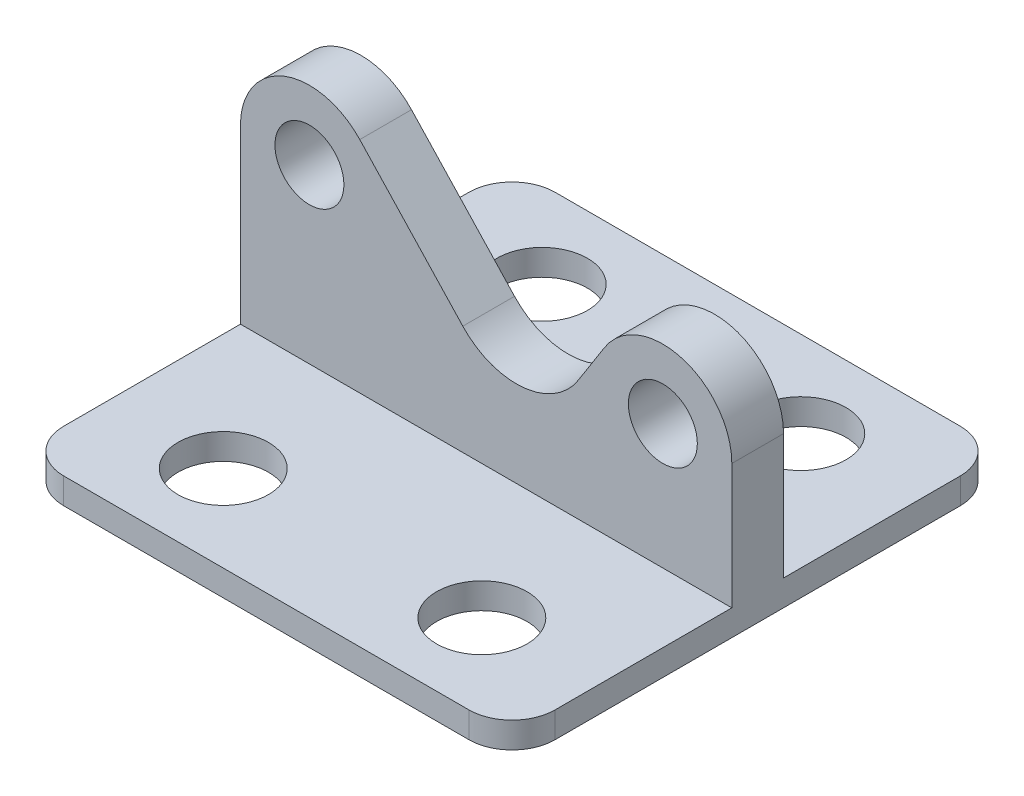
ISO-10303-21;
HEADER;
FILE_DESCRIPTION(('STEP AP214'),'2;1');
FILE_NAME('part.step','',(''),(''),'','','');
FILE_SCHEMA(('AUTOMOTIVE_DESIGN { 1 0 10303 214 1 1 1 1 }'));
ENDSEC;
DATA;
#1=APPLICATION_CONTEXT('core data for automotive mechanical design processes');
#2=APPLICATION_PROTOCOL_DEFINITION('international standard','automotive_design',2000,#1);
#3=PRODUCT_CONTEXT('',#1,'mechanical');
#4=PRODUCT('Part','Part','',(#3));
#5=PRODUCT_RELATED_PRODUCT_CATEGORY('part','',(#4));
#6=PRODUCT_DEFINITION_FORMATION('','',#4);
#7=PRODUCT_DEFINITION_CONTEXT('part definition',#1,'design');
#8=PRODUCT_DEFINITION('design','',#6,#7);
#9=PRODUCT_DEFINITION_SHAPE('','',#8);
#10=(LENGTH_UNIT() NAMED_UNIT(*) SI_UNIT(.MILLI.,.METRE.));
#11=(NAMED_UNIT(*) PLANE_ANGLE_UNIT() SI_UNIT($,.RADIAN.));
#12=(NAMED_UNIT(*) SI_UNIT($,.STERADIAN.) SOLID_ANGLE_UNIT());
#13=UNCERTAINTY_MEASURE_WITH_UNIT(LENGTH_MEASURE(1.E-05),#10,'distance_accuracy_value','');
#14=(GEOMETRIC_REPRESENTATION_CONTEXT(3) GLOBAL_UNCERTAINTY_ASSIGNED_CONTEXT((#13)) GLOBAL_UNIT_ASSIGNED_CONTEXT((#10,
#11,#12)) REPRESENTATION_CONTEXT('',''));
#15=CARTESIAN_POINT('',(0.,0.,0.));
#16=DIRECTION('',(0.,0.,1.));
#17=DIRECTION('',(1.,0.,0.));
#18=AXIS2_PLACEMENT_3D('',#15,#16,#17);
#19=CARTESIAN_POINT('',(49.,17.5,3.));
#20=DIRECTION('',(0.,0.,1.));
#21=DIRECTION('',(1.,0.,0.));
#22=AXIS2_PLACEMENT_3D('',#19,#20,#21);
#23=PLANE('',#22);
#24=DIRECTION('',(-1.,0.,0.));
#25=VECTOR('',#24,1.);
#26=CARTESIAN_POINT('',(49.,3.,3.));
#27=LINE('',#26,#25);
#28=CARTESIAN_POINT('',(57.,3.,3.));
#29=VERTEX_POINT('',#28);
#30=CARTESIAN_POINT('',(0.,3.,3.));
#31=VERTEX_POINT('',#30);
#32=EDGE_CURVE('E54',#29,#31,#27,.T.);
#33=ORIENTED_EDGE('',*,*,#32,.F.);
#34=DIRECTION('',(0.,1.,0.));
#35=VECTOR('',#34,1.);
#36=CARTESIAN_POINT('',(57.,0.,3.));
#37=LINE('',#36,#35);
#38=CARTESIAN_POINT('',(57.,17.5,3.));
#39=VERTEX_POINT('',#38);
#40=EDGE_CURVE('E211',#29,#39,#37,.T.);
#41=ORIENTED_EDGE('',*,*,#40,.T.);
#42=CARTESIAN_POINT('',(49.,17.5,3.));
#43=DIRECTION('',(0.,0.,1.));
#44=DIRECTION('',(1.,0.,0.));
#45=AXIS2_PLACEMENT_3D('',#42,#43,#44);
#46=CIRCLE('',#45,8.);
#47=CARTESIAN_POINT('',(42.243043836971,21.7829363071267,3.));
#48=VERTEX_POINT('',#47);
#49=EDGE_CURVE('E213',#39,#48,#46,.T.);
#50=ORIENTED_EDGE('',*,*,#49,.T.);
#51=DIRECTION('',(-0.535367038390841,-0.844619520378626,0.));
#52=VECTOR('',#51,1.);
#53=CARTESIAN_POINT('',(42.243043836971,21.7829363071267,3.));
#54=LINE('',#53,#52);
#55=CARTESIAN_POINT('',(39.1792659232183,16.9493801736778,3.));
#56=VERTEX_POINT('',#55);
#57=EDGE_CURVE('E215',#48,#56,#54,.T.);
#58=ORIENTED_EDGE('',*,*,#57,.T.);
#59=CARTESIAN_POINT('',(32.,21.5,3.));
#60=DIRECTION('',(0.,0.,-1.));
#61=DIRECTION('',(-1.,0.,0.));
#62=AXIS2_PLACEMENT_3D('',#59,#60,#61);
#63=CIRCLE('',#62,8.50000000000001);
#64=CARTESIAN_POINT('',(25.7932833376951,15.6925334031209,3.));
#65=VERTEX_POINT('',#64);
#66=EDGE_CURVE('E217',#56,#65,#63,.T.);
#67=ORIENTED_EDGE('',*,*,#66,.T.);
#68=DIRECTION('',(-0.683231364338715,0.73020196027117,0.));
#69=VECTOR('',#68,1.);
#70=CARTESIAN_POINT('',(25.7932833376951,15.6925334031209,3.));
#71=LINE('',#70,#69);
#72=CARTESIAN_POINT('',(13.8416156821694,28.4658509147097,3.));
#73=VERTEX_POINT('',#72);
#74=EDGE_CURVE('E219',#65,#73,#71,.T.);
#75=ORIENTED_EDGE('',*,*,#74,.T.);
#76=CARTESIAN_POINT('',(8.,23.,3.));
#77=DIRECTION('',(0.,0.,1.));
#78=DIRECTION('',(1.,0.,0.));
#79=AXIS2_PLACEMENT_3D('',#76,#77,#78);
#80=CIRCLE('',#79,8.);
#81=CARTESIAN_POINT('',(0.,23.,3.));
#82=VERTEX_POINT('',#81);
#83=EDGE_CURVE('E221',#73,#82,#80,.T.);
#84=ORIENTED_EDGE('',*,*,#83,.T.);
#85=DIRECTION('',(0.,-1.,0.));
#86=VECTOR('',#85,1.);
#87=CARTESIAN_POINT('',(0.,23.,3.));
#88=LINE('',#87,#86);
#89=EDGE_CURVE('E50',#82,#31,#88,.T.);
#90=ORIENTED_EDGE('',*,*,#89,.T.);
#91=EDGE_LOOP('',(#33,#41,#50,#58,#67,#75,#84,#90));
#92=FACE_BOUND('',#91,.T.);
#93=CARTESIAN_POINT('',(49.,17.5,3.));
#94=DIRECTION('',(0.,0.,1.));
#95=DIRECTION('',(1.,0.,0.));
#96=AXIS2_PLACEMENT_3D('',#93,#94,#95);
#97=CIRCLE('',#96,4.);
#98=CARTESIAN_POINT('',(53.,17.5,3.));
#99=VERTEX_POINT('',#98);
#100=EDGE_CURVE('E207',#99,#99,#97,.T.);
#101=ORIENTED_EDGE('',*,*,#100,.F.);
#102=EDGE_LOOP('',(#101));
#103=FACE_BOUND('',#102,.T.);
#104=CARTESIAN_POINT('',(8.,23.,3.));
#105=DIRECTION('',(0.,0.,1.));
#106=DIRECTION('',(1.,0.,0.));
#107=AXIS2_PLACEMENT_3D('',#104,#105,#106);
#108=CIRCLE('',#107,4.);
#109=CARTESIAN_POINT('',(12.,23.,3.));
#110=VERTEX_POINT('',#109);
#111=EDGE_CURVE('E204',#110,#110,#108,.T.);
#112=ORIENTED_EDGE('',*,*,#111,.F.);
#113=EDGE_LOOP('',(#112));
#114=FACE_BOUND('',#113,.T.);
#115=ADVANCED_FACE('F35',(#92,#103,#114),#23,.T.);
#116=CARTESIAN_POINT('',(0.,23.,3.));
#117=DIRECTION('',(1.,0.,0.));
#118=DIRECTION('',(0.,0.,-1.));
#119=AXIS2_PLACEMENT_3D('',#116,#117,#118);
#120=PLANE('',#119);
#121=DIRECTION('',(0.,-1.,0.));
#122=VECTOR('',#121,1.);
#123=CARTESIAN_POINT('',(0.,23.,-3.));
#124=LINE('',#123,#122);
#125=CARTESIAN_POINT('',(0.,23.,-3.));
#126=VERTEX_POINT('',#125);
#127=CARTESIAN_POINT('',(0.,3.,-3.));
#128=VERTEX_POINT('',#127);
#129=EDGE_CURVE('E184',#126,#128,#124,.T.);
#130=ORIENTED_EDGE('',*,*,#129,.T.);
#131=DIRECTION('',(0.,0.,1.));
#132=VECTOR('',#131,1.);
#133=CARTESIAN_POINT('',(0.,3.,-23.5));
#134=LINE('',#133,#132);
#135=CARTESIAN_POINT('',(0.,3.,-23.5));
#136=VERTEX_POINT('',#135);
#137=EDGE_CURVE('E256',#136,#128,#134,.T.);
#138=ORIENTED_EDGE('',*,*,#137,.F.);
#139=DIRECTION('',(0.,-1.,0.));
#140=VECTOR('',#139,1.);
#141=CARTESIAN_POINT('',(0.,3.,-23.5));
#142=LINE('',#141,#140);
#143=CARTESIAN_POINT('',(0.,0.,-23.5));
#144=VERTEX_POINT('',#143);
#145=EDGE_CURVE('E250',#136,#144,#142,.T.);
#146=ORIENTED_EDGE('',*,*,#145,.T.);
#147=DIRECTION('',(0.,0.,-1.));
#148=VECTOR('',#147,1.);
#149=CARTESIAN_POINT('',(0.,0.,3.));
#150=LINE('',#149,#148);
#151=CARTESIAN_POINT('',(0.,0.,23.5));
#152=VERTEX_POINT('',#151);
#153=EDGE_CURVE('E43',#152,#144,#150,.T.);
#154=ORIENTED_EDGE('',*,*,#153,.F.);
#155=DIRECTION('',(0.,-1.,0.));
#156=VECTOR('',#155,1.);
#157=CARTESIAN_POINT('',(0.,3.,23.5));
#158=LINE('',#157,#156);
#159=CARTESIAN_POINT('',(0.,3.,23.5));
#160=VERTEX_POINT('',#159);
#161=EDGE_CURVE('E257',#160,#152,#158,.T.);
#162=ORIENTED_EDGE('',*,*,#161,.F.);
#163=EDGE_CURVE('E163',#31,#160,#134,.T.);
#164=ORIENTED_EDGE('',*,*,#163,.F.);
#165=ORIENTED_EDGE('',*,*,#89,.F.);
#166=DIRECTION('',(0.,0.,-1.));
#167=VECTOR('',#166,1.);
#168=CARTESIAN_POINT('',(0.,23.,3.));
#169=LINE('',#168,#167);
#170=EDGE_CURVE('E223',#82,#126,#169,.T.);
#171=ORIENTED_EDGE('',*,*,#170,.T.);
#172=EDGE_LOOP('',(#130,#138,#146,#154,#162,#164,#165,#171));
#173=FACE_BOUND('',#172,.T.);
#174=ADVANCED_FACE('F37',(#173),#120,.F.);
#175=CARTESIAN_POINT('',(0.,0.,3.));
#176=DIRECTION('',(0.,1.,0.));
#177=DIRECTION('',(0.,0.,1.));
#178=AXIS2_PLACEMENT_3D('',#175,#176,#177);
#179=PLANE('',#178);
#180=ORIENTED_EDGE('',*,*,#153,.T.);
#181=CARTESIAN_POINT('',(5.,0.,-23.5));
#182=DIRECTION('',(0.,1.,0.));
#183=DIRECTION('',(0.,0.,1.));
#184=AXIS2_PLACEMENT_3D('',#181,#182,#183);
#185=CIRCLE('',#184,5.);
#186=CARTESIAN_POINT('',(5.,0.,-28.5));
#187=VERTEX_POINT('',#186);
#188=EDGE_CURVE('E167',#187,#144,#185,.T.);
#189=ORIENTED_EDGE('',*,*,#188,.F.);
#190=DIRECTION('',(-1.,0.,0.));
#191=VECTOR('',#190,1.);
#192=CARTESIAN_POINT('',(52.,0.,-28.5));
#193=LINE('',#192,#191);
#194=CARTESIAN_POINT('',(52.,0.,-28.5));
#195=VERTEX_POINT('',#194);
#196=EDGE_CURVE('E254',#195,#187,#193,.T.);
#197=ORIENTED_EDGE('',*,*,#196,.F.);
#198=CARTESIAN_POINT('',(52.,0.,-23.5));
#199=DIRECTION('',(0.,1.,0.));
#200=DIRECTION('',(0.,0.,1.));
#201=AXIS2_PLACEMENT_3D('',#198,#199,#200);
#202=CIRCLE('',#201,5.00000000000001);
#203=CARTESIAN_POINT('',(57.,0.,-23.5));
#204=VERTEX_POINT('',#203);
#205=EDGE_CURVE('E279',#204,#195,#202,.T.);
#206=ORIENTED_EDGE('',*,*,#205,.F.);
#207=DIRECTION('',(0.,0.,-1.));
#208=VECTOR('',#207,1.);
#209=CARTESIAN_POINT('',(57.,0.,3.));
#210=LINE('',#209,#208);
#211=CARTESIAN_POINT('',(57.,0.,23.5));
#212=VERTEX_POINT('',#211);
#213=EDGE_CURVE('E236',#212,#204,#210,.T.);
#214=ORIENTED_EDGE('',*,*,#213,.F.);
#215=CARTESIAN_POINT('',(52.,0.,23.5));
#216=DIRECTION('',(0.,1.,0.));
#217=DIRECTION('',(0.,0.,1.));
#218=AXIS2_PLACEMENT_3D('',#215,#216,#217);
#219=CIRCLE('',#218,5.00000000000001);
#220=CARTESIAN_POINT('',(52.,0.,28.5));
#221=VERTEX_POINT('',#220);
#222=EDGE_CURVE('E278',#221,#212,#219,.T.);
#223=ORIENTED_EDGE('',*,*,#222,.F.);
#224=DIRECTION('',(1.,0.,0.));
#225=VECTOR('',#224,1.);
#226=CARTESIAN_POINT('',(5.,0.,28.5));
#227=LINE('',#226,#225);
#228=CARTESIAN_POINT('',(5.,0.,28.5));
#229=VERTEX_POINT('',#228);
#230=EDGE_CURVE('E280',#229,#221,#227,.T.);
#231=ORIENTED_EDGE('',*,*,#230,.F.);
#232=CARTESIAN_POINT('',(5.,0.,23.5));
#233=DIRECTION('',(0.,1.,0.));
#234=DIRECTION('',(0.,0.,1.));
#235=AXIS2_PLACEMENT_3D('',#232,#233,#234);
#236=CIRCLE('',#235,5.);
#237=EDGE_CURVE('E171',#152,#229,#236,.T.);
#238=ORIENTED_EDGE('',*,*,#237,.F.);
#239=EDGE_LOOP('',(#180,#189,#197,#206,#214,#223,#231,#238));
#240=FACE_BOUND('',#239,.T.);
#241=CARTESIAN_POINT('',(13.5,0.,-18.5));
#242=DIRECTION('',(0.,1.,0.));
#243=DIRECTION('',(0.,0.,1.));
#244=AXIS2_PLACEMENT_3D('',#241,#242,#243);
#245=CIRCLE('',#244,5.25);
#246=CARTESIAN_POINT('',(13.5,0.,-13.25));
#247=VERTEX_POINT('',#246);
#248=EDGE_CURVE('E341',#247,#247,#245,.T.);
#249=ORIENTED_EDGE('',*,*,#248,.T.);
#250=EDGE_LOOP('',(#249));
#251=FACE_BOUND('',#250,.T.);
#252=CARTESIAN_POINT('',(43.5,0.,-18.5));
#253=DIRECTION('',(0.,1.,0.));
#254=DIRECTION('',(0.,0.,1.));
#255=AXIS2_PLACEMENT_3D('',#252,#253,#254);
#256=CIRCLE('',#255,5.25);
#257=CARTESIAN_POINT('',(43.5,0.,-13.25));
#258=VERTEX_POINT('',#257);
#259=EDGE_CURVE('E329',#258,#258,#256,.T.);
#260=ORIENTED_EDGE('',*,*,#259,.T.);
#261=EDGE_LOOP('',(#260));
#262=FACE_BOUND('',#261,.T.);
#263=CARTESIAN_POINT('',(43.5,0.,18.5));
#264=DIRECTION('',(0.,1.,0.));
#265=DIRECTION('',(0.,0.,1.));
#266=AXIS2_PLACEMENT_3D('',#263,#264,#265);
#267=CIRCLE('',#266,5.25);
#268=CARTESIAN_POINT('',(43.5,0.,23.75));
#269=VERTEX_POINT('',#268);
#270=EDGE_CURVE('E321',#269,#269,#267,.T.);
#271=ORIENTED_EDGE('',*,*,#270,.T.);
#272=EDGE_LOOP('',(#271));
#273=FACE_BOUND('',#272,.T.);
#274=CARTESIAN_POINT('',(13.5,0.,18.5));
#275=DIRECTION('',(0.,1.,0.));
#276=DIRECTION('',(0.,0.,1.));
#277=AXIS2_PLACEMENT_3D('',#274,#275,#276);
#278=CIRCLE('',#277,5.25);
#279=CARTESIAN_POINT('',(13.5,0.,23.75));
#280=VERTEX_POINT('',#279);
#281=EDGE_CURVE('E335',#280,#280,#278,.T.);
#282=ORIENTED_EDGE('',*,*,#281,.T.);
#283=EDGE_LOOP('',(#282));
#284=FACE_BOUND('',#283,.T.);
#285=ADVANCED_FACE('F240',(#240,#251,#262,#273,#284),#179,.F.);
#286=CARTESIAN_POINT('',(57.,0.,3.));
#287=DIRECTION('',(-1.,0.,0.));
#288=DIRECTION('',(0.,0.,1.));
#289=AXIS2_PLACEMENT_3D('',#286,#287,#288);
#290=PLANE('',#289);
#291=ORIENTED_EDGE('',*,*,#40,.F.);
#292=DIRECTION('',(0.,0.,-1.));
#293=VECTOR('',#292,1.);
#294=CARTESIAN_POINT('',(57.,3.,23.5));
#295=LINE('',#294,#293);
#296=CARTESIAN_POINT('',(57.,3.,23.5));
#297=VERTEX_POINT('',#296);
#298=EDGE_CURVE('E273',#297,#29,#295,.T.);
#299=ORIENTED_EDGE('',*,*,#298,.F.);
#300=DIRECTION('',(0.,-1.,0.));
#301=VECTOR('',#300,1.);
#302=CARTESIAN_POINT('',(57.,3.,23.5));
#303=LINE('',#302,#301);
#304=EDGE_CURVE('E175',#297,#212,#303,.T.);
#305=ORIENTED_EDGE('',*,*,#304,.T.);
#306=ORIENTED_EDGE('',*,*,#213,.T.);
#307=DIRECTION('',(0.,-1.,0.));
#308=VECTOR('',#307,1.);
#309=CARTESIAN_POINT('',(57.,3.,-23.5));
#310=LINE('',#309,#308);
#311=CARTESIAN_POINT('',(57.,3.,-23.5));
#312=VERTEX_POINT('',#311);
#313=EDGE_CURVE('E265',#312,#204,#310,.T.);
#314=ORIENTED_EDGE('',*,*,#313,.F.);
#315=CARTESIAN_POINT('',(57.,3.,-3.));
#316=VERTEX_POINT('',#315);
#317=EDGE_CURVE('E296',#316,#312,#295,.T.);
#318=ORIENTED_EDGE('',*,*,#317,.F.);
#319=DIRECTION('',(0.,1.,0.));
#320=VECTOR('',#319,1.);
#321=CARTESIAN_POINT('',(57.,0.,-3.));
#322=LINE('',#321,#320);
#323=CARTESIAN_POINT('',(57.,17.5,-3.));
#324=VERTEX_POINT('',#323);
#325=EDGE_CURVE('E187',#316,#324,#322,.T.);
#326=ORIENTED_EDGE('',*,*,#325,.T.);
#327=DIRECTION('',(0.,0.,-1.));
#328=VECTOR('',#327,1.);
#329=CARTESIAN_POINT('',(57.,17.5,3.));
#330=LINE('',#329,#328);
#331=EDGE_CURVE('E233',#39,#324,#330,.T.);
#332=ORIENTED_EDGE('',*,*,#331,.F.);
#333=EDGE_LOOP('',(#291,#299,#305,#306,#314,#318,#326,#332));
#334=FACE_BOUND('',#333,.T.);
#335=ADVANCED_FACE('F271',(#334),#290,.F.);
#336=CARTESIAN_POINT('',(49.,17.5,3.));
#337=DIRECTION('',(0.,0.,-1.));
#338=DIRECTION('',(-1.,0.,0.));
#339=AXIS2_PLACEMENT_3D('',#336,#337,#338);
#340=CYLINDRICAL_SURFACE('',#339,8.);
#341=ORIENTED_EDGE('',*,*,#331,.T.);
#342=CARTESIAN_POINT('',(49.,17.5,-3.));
#343=DIRECTION('',(0.,0.,1.));
#344=DIRECTION('',(1.,0.,0.));
#345=AXIS2_PLACEMENT_3D('',#342,#343,#344);
#346=CIRCLE('',#345,8.);
#347=CARTESIAN_POINT('',(42.243043836971,21.7829363071267,-3.));
#348=VERTEX_POINT('',#347);
#349=EDGE_CURVE('E189',#324,#348,#346,.T.);
#350=ORIENTED_EDGE('',*,*,#349,.T.);
#351=DIRECTION('',(0.,0.,-1.));
#352=VECTOR('',#351,1.);
#353=CARTESIAN_POINT('',(42.243043836971,21.7829363071267,3.));
#354=LINE('',#353,#352);
#355=EDGE_CURVE('E231',#48,#348,#354,.T.);
#356=ORIENTED_EDGE('',*,*,#355,.F.);
#357=ORIENTED_EDGE('',*,*,#49,.F.);
#358=EDGE_LOOP('',(#341,#350,#356,#357));
#359=FACE_BOUND('',#358,.T.);
#360=ADVANCED_FACE('F309',(#359),#340,.T.);
#361=CARTESIAN_POINT('',(42.243043836971,21.7829363071267,3.));
#362=DIRECTION('',(0.844619520378626,-0.535367038390841,0.));
#363=DIRECTION('',(0.535367038390841,0.844619520378626,0.));
#364=AXIS2_PLACEMENT_3D('',#361,#362,#363);
#365=PLANE('',#364);
#366=ORIENTED_EDGE('',*,*,#355,.T.);
#367=DIRECTION('',(-0.535367038390841,-0.844619520378626,0.));
#368=VECTOR('',#367,1.);
#369=CARTESIAN_POINT('',(42.243043836971,21.7829363071267,-3.));
#370=LINE('',#369,#368);
#371=CARTESIAN_POINT('',(39.1792659232183,16.9493801736778,-3.));
#372=VERTEX_POINT('',#371);
#373=EDGE_CURVE('E192',#348,#372,#370,.T.);
#374=ORIENTED_EDGE('',*,*,#373,.T.);
#375=DIRECTION('',(0.,0.,-1.));
#376=VECTOR('',#375,1.);
#377=CARTESIAN_POINT('',(39.1792659232183,16.9493801736778,3.));
#378=LINE('',#377,#376);
#379=EDGE_CURVE('E229',#56,#372,#378,.T.);
#380=ORIENTED_EDGE('',*,*,#379,.F.);
#381=ORIENTED_EDGE('',*,*,#57,.F.);
#382=EDGE_LOOP('',(#366,#374,#380,#381));
#383=FACE_BOUND('',#382,.T.);
#384=ADVANCED_FACE('F399',(#383),#365,.F.);
#385=CARTESIAN_POINT('',(32.,21.5,3.));
#386=DIRECTION('',(0.,0.,-1.));
#387=DIRECTION('',(-1.,0.,0.));
#388=AXIS2_PLACEMENT_3D('',#385,#386,#387);
#389=CYLINDRICAL_SURFACE('',#388,8.50000000000001);
#390=ORIENTED_EDGE('',*,*,#379,.T.);
#391=CARTESIAN_POINT('',(32.,21.5,-3.));
#392=DIRECTION('',(0.,0.,-1.));
#393=DIRECTION('',(-1.,0.,0.));
#394=AXIS2_PLACEMENT_3D('',#391,#392,#393);
#395=CIRCLE('',#394,8.50000000000001);
#396=CARTESIAN_POINT('',(25.7932833376951,15.6925334031209,-3.));
#397=VERTEX_POINT('',#396);
#398=EDGE_CURVE('E195',#372,#397,#395,.T.);
#399=ORIENTED_EDGE('',*,*,#398,.T.);
#400=DIRECTION('',(0.,0.,-1.));
#401=VECTOR('',#400,1.);
#402=CARTESIAN_POINT('',(25.7932833376951,15.6925334031209,3.));
#403=LINE('',#402,#401);
#404=EDGE_CURVE('E227',#65,#397,#403,.T.);
#405=ORIENTED_EDGE('',*,*,#404,.F.);
#406=ORIENTED_EDGE('',*,*,#66,.F.);
#407=EDGE_LOOP('',(#390,#399,#405,#406));
#408=FACE_BOUND('',#407,.T.);
#409=ADVANCED_FACE('F395',(#408),#389,.F.);
#410=CARTESIAN_POINT('',(25.7932833376951,15.6925334031209,3.));
#411=DIRECTION('',(-0.730201960271169,-0.683231364338714,0.));
#412=DIRECTION('',(0.683231364338715,-0.73020196027117,0.));
#413=AXIS2_PLACEMENT_3D('',#410,#411,#412);
#414=PLANE('',#413);
#415=ORIENTED_EDGE('',*,*,#404,.T.);
#416=DIRECTION('',(-0.683231364338715,0.73020196027117,0.));
#417=VECTOR('',#416,1.);
#418=CARTESIAN_POINT('',(25.7932833376951,15.6925334031209,-3.));
#419=LINE('',#418,#417);
#420=CARTESIAN_POINT('',(13.8416156821694,28.4658509147097,-3.));
#421=VERTEX_POINT('',#420);
#422=EDGE_CURVE('E198',#397,#421,#419,.T.);
#423=ORIENTED_EDGE('',*,*,#422,.T.);
#424=DIRECTION('',(0.,0.,-1.));
#425=VECTOR('',#424,1.);
#426=CARTESIAN_POINT('',(13.8416156821694,28.4658509147097,3.));
#427=LINE('',#426,#425);
#428=EDGE_CURVE('E225',#73,#421,#427,.T.);
#429=ORIENTED_EDGE('',*,*,#428,.F.);
#430=ORIENTED_EDGE('',*,*,#74,.F.);
#431=EDGE_LOOP('',(#415,#423,#429,#430));
#432=FACE_BOUND('',#431,.T.);
#433=ADVANCED_FACE('F391',(#432),#414,.F.);
#434=CARTESIAN_POINT('',(8.,23.,3.));
#435=DIRECTION('',(0.,0.,-1.));
#436=DIRECTION('',(-1.,0.,0.));
#437=AXIS2_PLACEMENT_3D('',#434,#435,#436);
#438=CYLINDRICAL_SURFACE('',#437,8.);
#439=ORIENTED_EDGE('',*,*,#428,.T.);
#440=CARTESIAN_POINT('',(8.,23.,-3.));
#441=DIRECTION('',(0.,0.,1.));
#442=DIRECTION('',(1.,0.,0.));
#443=AXIS2_PLACEMENT_3D('',#440,#441,#442);
#444=CIRCLE('',#443,8.);
#445=EDGE_CURVE('E201',#421,#126,#444,.T.);
#446=ORIENTED_EDGE('',*,*,#445,.T.);
#447=ORIENTED_EDGE('',*,*,#170,.F.);
#448=ORIENTED_EDGE('',*,*,#83,.F.);
#449=EDGE_LOOP('',(#439,#446,#447,#448));
#450=FACE_BOUND('',#449,.T.);
#451=ADVANCED_FACE('F388',(#450),#438,.T.);
#452=CARTESIAN_POINT('',(49.,17.5,3.));
#453=DIRECTION('',(0.,0.,-1.));
#454=DIRECTION('',(-1.,0.,0.));
#455=AXIS2_PLACEMENT_3D('',#452,#453,#454);
#456=CYLINDRICAL_SURFACE('',#455,4.);
#457=ORIENTED_EDGE('',*,*,#100,.T.);
#458=EDGE_LOOP('',(#457));
#459=FACE_BOUND('',#458,.T.);
#460=CARTESIAN_POINT('',(49.,17.5,-3.));
#461=DIRECTION('',(0.,0.,1.));
#462=DIRECTION('',(1.,0.,0.));
#463=AXIS2_PLACEMENT_3D('',#460,#461,#462);
#464=CIRCLE('',#463,4.);
#465=CARTESIAN_POINT('',(53.,17.5,-3.));
#466=VERTEX_POINT('',#465);
#467=EDGE_CURVE('E181',#466,#466,#464,.T.);
#468=ORIENTED_EDGE('',*,*,#467,.F.);
#469=EDGE_LOOP('',(#468));
#470=FACE_BOUND('',#469,.T.);
#471=ADVANCED_FACE('F386',(#459,#470),#456,.F.);
#472=CARTESIAN_POINT('',(8.,23.,3.));
#473=DIRECTION('',(0.,0.,-1.));
#474=DIRECTION('',(-1.,0.,0.));
#475=AXIS2_PLACEMENT_3D('',#472,#473,#474);
#476=CYLINDRICAL_SURFACE('',#475,4.);
#477=ORIENTED_EDGE('',*,*,#111,.T.);
#478=EDGE_LOOP('',(#477));
#479=FACE_BOUND('',#478,.T.);
#480=CARTESIAN_POINT('',(8.,23.,-3.));
#481=DIRECTION('',(0.,0.,1.));
#482=DIRECTION('',(1.,0.,0.));
#483=AXIS2_PLACEMENT_3D('',#480,#481,#482);
#484=CIRCLE('',#483,4.);
#485=CARTESIAN_POINT('',(12.,23.,-3.));
#486=VERTEX_POINT('',#485);
#487=EDGE_CURVE('E173',#486,#486,#484,.T.);
#488=ORIENTED_EDGE('',*,*,#487,.F.);
#489=EDGE_LOOP('',(#488));
#490=FACE_BOUND('',#489,.T.);
#491=ADVANCED_FACE('F442',(#479,#490),#476,.F.);
#492=CARTESIAN_POINT('',(49.,17.5,-3.));
#493=DIRECTION('',(0.,0.,1.));
#494=DIRECTION('',(1.,0.,0.));
#495=AXIS2_PLACEMENT_3D('',#492,#493,#494);
#496=PLANE('',#495);
#497=ORIENTED_EDGE('',*,*,#487,.T.);
#498=EDGE_LOOP('',(#497));
#499=FACE_BOUND('',#498,.T.);
#500=ORIENTED_EDGE('',*,*,#467,.T.);
#501=EDGE_LOOP('',(#500));
#502=FACE_BOUND('',#501,.T.);
#503=ORIENTED_EDGE('',*,*,#325,.F.);
#504=DIRECTION('',(-1.,0.,0.));
#505=VECTOR('',#504,1.);
#506=CARTESIAN_POINT('',(49.,3.,-3.));
#507=LINE('',#506,#505);
#508=EDGE_CURVE('E11',#316,#128,#507,.T.);
#509=ORIENTED_EDGE('',*,*,#508,.T.);
#510=ORIENTED_EDGE('',*,*,#129,.F.);
#511=ORIENTED_EDGE('',*,*,#445,.F.);
#512=ORIENTED_EDGE('',*,*,#422,.F.);
#513=ORIENTED_EDGE('',*,*,#398,.F.);
#514=ORIENTED_EDGE('',*,*,#373,.F.);
#515=ORIENTED_EDGE('',*,*,#349,.F.);
#516=EDGE_LOOP('',(#503,#509,#510,#511,#512,#513,#514,#515));
#517=FACE_BOUND('',#516,.T.);
#518=ADVANCED_FACE('F303',(#499,#502,#517),#496,.F.);
#519=CARTESIAN_POINT('',(52.,3.,-28.5));
#520=DIRECTION('',(0.,0.,1.));
#521=DIRECTION('',(1.,0.,0.));
#522=AXIS2_PLACEMENT_3D('',#519,#520,#521);
#523=PLANE('',#522);
#524=ORIENTED_EDGE('',*,*,#196,.T.);
#525=DIRECTION('',(0.,-1.,0.));
#526=VECTOR('',#525,1.);
#527=CARTESIAN_POINT('',(5.,3.,-28.5));
#528=LINE('',#527,#526);
#529=CARTESIAN_POINT('',(5.,3.,-28.5));
#530=VERTEX_POINT('',#529);
#531=EDGE_CURVE('E253',#530,#187,#528,.T.);
#532=ORIENTED_EDGE('',*,*,#531,.F.);
#533=DIRECTION('',(-1.,0.,0.));
#534=VECTOR('',#533,1.);
#535=CARTESIAN_POINT('',(52.,3.,-28.5));
#536=LINE('',#535,#534);
#537=CARTESIAN_POINT('',(52.,3.,-28.5));
#538=VERTEX_POINT('',#537);
#539=EDGE_CURVE('E312',#538,#530,#536,.T.);
#540=ORIENTED_EDGE('',*,*,#539,.F.);
#541=DIRECTION('',(0.,-1.,0.));
#542=VECTOR('',#541,1.);
#543=CARTESIAN_POINT('',(52.,3.,-28.5));
#544=LINE('',#543,#542);
#545=EDGE_CURVE('E259',#538,#195,#544,.T.);
#546=ORIENTED_EDGE('',*,*,#545,.T.);
#547=EDGE_LOOP('',(#524,#532,#540,#546));
#548=FACE_BOUND('',#547,.T.);
#549=ADVANCED_FACE('F287',(#548),#523,.F.);
#550=CARTESIAN_POINT('',(43.5,3.,-18.5));
#551=DIRECTION('',(0.,-1.,0.));
#552=DIRECTION('',(0.,0.,-1.));
#553=AXIS2_PLACEMENT_3D('',#550,#551,#552);
#554=CYLINDRICAL_SURFACE('',#553,5.25);
#555=CARTESIAN_POINT('',(43.5,3.,-18.5));
#556=DIRECTION('',(0.,1.,0.));
#557=DIRECTION('',(0.,0.,1.));
#558=AXIS2_PLACEMENT_3D('',#555,#556,#557);
#559=CIRCLE('',#558,5.25);
#560=CARTESIAN_POINT('',(43.5,3.,-13.25));
#561=VERTEX_POINT('',#560);
#562=EDGE_CURVE('E326',#561,#561,#559,.T.);
#563=ORIENTED_EDGE('',*,*,#562,.T.);
#564=EDGE_LOOP('',(#563));
#565=FACE_BOUND('',#564,.T.);
#566=ORIENTED_EDGE('',*,*,#259,.F.);
#567=EDGE_LOOP('',(#566));
#568=FACE_BOUND('',#567,.T.);
#569=ADVANCED_FACE('F356',(#565,#568),#554,.F.);
#570=CARTESIAN_POINT('',(13.5,3.,-18.5));
#571=DIRECTION('',(0.,-1.,0.));
#572=DIRECTION('',(0.,0.,-1.));
#573=AXIS2_PLACEMENT_3D('',#570,#571,#572);
#574=CYLINDRICAL_SURFACE('',#573,5.25);
#575=CARTESIAN_POINT('',(13.5,3.,-18.5));
#576=DIRECTION('',(0.,1.,0.));
#577=DIRECTION('',(0.,0.,1.));
#578=AXIS2_PLACEMENT_3D('',#575,#576,#577);
#579=CIRCLE('',#578,5.25);
#580=CARTESIAN_POINT('',(13.5,3.,-13.25));
#581=VERTEX_POINT('',#580);
#582=EDGE_CURVE('E338',#581,#581,#579,.T.);
#583=ORIENTED_EDGE('',*,*,#582,.T.);
#584=EDGE_LOOP('',(#583));
#585=FACE_BOUND('',#584,.T.);
#586=ORIENTED_EDGE('',*,*,#248,.F.);
#587=EDGE_LOOP('',(#586));
#588=FACE_BOUND('',#587,.T.);
#589=ADVANCED_FACE('F347',(#585,#588),#574,.F.);
#590=CARTESIAN_POINT('',(52.,3.,-23.5));
#591=DIRECTION('',(0.,-1.,0.));
#592=DIRECTION('',(0.,0.,-1.));
#593=AXIS2_PLACEMENT_3D('',#590,#591,#592);
#594=CYLINDRICAL_SURFACE('',#593,5.00000000000001);
#595=ORIENTED_EDGE('',*,*,#205,.T.);
#596=ORIENTED_EDGE('',*,*,#545,.F.);
#597=CARTESIAN_POINT('',(52.,3.,-23.5));
#598=DIRECTION('',(0.,1.,0.));
#599=DIRECTION('',(0.,0.,1.));
#600=AXIS2_PLACEMENT_3D('',#597,#598,#599);
#601=CIRCLE('',#600,5.00000000000001);
#602=EDGE_CURVE('E294',#312,#538,#601,.T.);
#603=ORIENTED_EDGE('',*,*,#602,.F.);
#604=ORIENTED_EDGE('',*,*,#313,.T.);
#605=EDGE_LOOP('',(#595,#596,#603,#604));
#606=FACE_BOUND('',#605,.T.);
#607=ADVANCED_FACE('F292',(#606),#594,.T.);
#608=CARTESIAN_POINT('',(5.,3.,-23.5));
#609=DIRECTION('',(0.,-1.,0.));
#610=DIRECTION('',(0.,0.,-1.));
#611=AXIS2_PLACEMENT_3D('',#608,#609,#610);
#612=CYLINDRICAL_SURFACE('',#611,5.);
#613=ORIENTED_EDGE('',*,*,#188,.T.);
#614=ORIENTED_EDGE('',*,*,#145,.F.);
#615=CARTESIAN_POINT('',(5.,3.,-23.5));
#616=DIRECTION('',(0.,1.,0.));
#617=DIRECTION('',(0.,0.,1.));
#618=AXIS2_PLACEMENT_3D('',#615,#616,#617);
#619=CIRCLE('',#618,5.);
#620=EDGE_CURVE('E317',#530,#136,#619,.T.);
#621=ORIENTED_EDGE('',*,*,#620,.F.);
#622=ORIENTED_EDGE('',*,*,#531,.T.);
#623=EDGE_LOOP('',(#613,#614,#621,#622));
#624=FACE_BOUND('',#623,.T.);
#625=ADVANCED_FACE('F248',(#624),#612,.T.);
#626=CARTESIAN_POINT('',(5.,3.,23.5));
#627=DIRECTION('',(0.,1.,0.));
#628=DIRECTION('',(0.,0.,1.));
#629=AXIS2_PLACEMENT_3D('',#626,#627,#628);
#630=PLANE('',#629);
#631=ORIENTED_EDGE('',*,*,#582,.F.);
#632=EDGE_LOOP('',(#631));
#633=FACE_BOUND('',#632,.T.);
#634=ORIENTED_EDGE('',*,*,#562,.F.);
#635=EDGE_LOOP('',(#634));
#636=FACE_BOUND('',#635,.T.);
#637=ORIENTED_EDGE('',*,*,#508,.F.);
#638=ORIENTED_EDGE('',*,*,#317,.T.);
#639=ORIENTED_EDGE('',*,*,#602,.T.);
#640=ORIENTED_EDGE('',*,*,#539,.T.);
#641=ORIENTED_EDGE('',*,*,#620,.T.);
#642=ORIENTED_EDGE('',*,*,#137,.T.);
#643=EDGE_LOOP('',(#637,#638,#639,#640,#641,#642));
#644=FACE_BOUND('',#643,.T.);
#645=ADVANCED_FACE('F350',(#633,#636,#644),#630,.T.);
#646=CARTESIAN_POINT('',(13.5,3.,18.5));
#647=DIRECTION('',(0.,1.,0.));
#648=DIRECTION('',(0.,0.,1.));
#649=AXIS2_PLACEMENT_3D('',#646,#647,#648);
#650=CIRCLE('',#649,5.25);
#651=CARTESIAN_POINT('',(13.5,3.,23.75));
#652=VERTEX_POINT('',#651);
#653=EDGE_CURVE('E332',#652,#652,#650,.T.);
#654=ORIENTED_EDGE('',*,*,#653,.F.);
#655=EDGE_LOOP('',(#654));
#656=FACE_BOUND('',#655,.T.);
#657=CARTESIAN_POINT('',(43.5,3.,18.5));
#658=DIRECTION('',(0.,1.,0.));
#659=DIRECTION('',(0.,0.,1.));
#660=AXIS2_PLACEMENT_3D('',#657,#658,#659);
#661=CIRCLE('',#660,5.25);
#662=CARTESIAN_POINT('',(43.5,3.,23.75));
#663=VERTEX_POINT('',#662);
#664=EDGE_CURVE('E319',#663,#663,#661,.T.);
#665=ORIENTED_EDGE('',*,*,#664,.F.);
#666=EDGE_LOOP('',(#665));
#667=FACE_BOUND('',#666,.T.);
#668=ORIENTED_EDGE('',*,*,#298,.T.);
#669=ORIENTED_EDGE('',*,*,#32,.T.);
#670=ORIENTED_EDGE('',*,*,#163,.T.);
#671=CARTESIAN_POINT('',(5.,3.,23.5));
#672=DIRECTION('',(0.,1.,0.));
#673=DIRECTION('',(0.,0.,1.));
#674=AXIS2_PLACEMENT_3D('',#671,#672,#673);
#675=CIRCLE('',#674,5.);
#676=CARTESIAN_POINT('',(5.,3.,28.5));
#677=VERTEX_POINT('',#676);
#678=EDGE_CURVE('E157',#160,#677,#675,.T.);
#679=ORIENTED_EDGE('',*,*,#678,.T.);
#680=DIRECTION('',(1.,0.,0.));
#681=VECTOR('',#680,1.);
#682=CARTESIAN_POINT('',(5.,3.,28.5));
#683=LINE('',#682,#681);
#684=CARTESIAN_POINT('',(52.,3.,28.5));
#685=VERTEX_POINT('',#684);
#686=EDGE_CURVE('E146',#677,#685,#683,.T.);
#687=ORIENTED_EDGE('',*,*,#686,.T.);
#688=CARTESIAN_POINT('',(52.,3.,23.5));
#689=DIRECTION('',(0.,1.,0.));
#690=DIRECTION('',(0.,0.,1.));
#691=AXIS2_PLACEMENT_3D('',#688,#689,#690);
#692=CIRCLE('',#691,5.00000000000001);
#693=EDGE_CURVE('E156',#685,#297,#692,.T.);
#694=ORIENTED_EDGE('',*,*,#693,.T.);
#695=EDGE_LOOP('',(#668,#669,#670,#679,#687,#694));
#696=FACE_BOUND('',#695,.T.);
#697=ADVANCED_FACE('F161',(#656,#667,#696),#630,.T.);
#698=CARTESIAN_POINT('',(5.,3.,23.5));
#699=DIRECTION('',(0.,-1.,0.));
#700=DIRECTION('',(0.,0.,-1.));
#701=AXIS2_PLACEMENT_3D('',#698,#699,#700);
#702=CYLINDRICAL_SURFACE('',#701,5.);
#703=ORIENTED_EDGE('',*,*,#237,.T.);
#704=DIRECTION('',(0.,-1.,0.));
#705=VECTOR('',#704,1.);
#706=CARTESIAN_POINT('',(5.,3.,28.5));
#707=LINE('',#706,#705);
#708=EDGE_CURVE('E150',#677,#229,#707,.T.);
#709=ORIENTED_EDGE('',*,*,#708,.F.);
#710=ORIENTED_EDGE('',*,*,#678,.F.);
#711=ORIENTED_EDGE('',*,*,#161,.T.);
#712=EDGE_LOOP('',(#703,#709,#710,#711));
#713=FACE_BOUND('',#712,.T.);
#714=ADVANCED_FACE('F169',(#713),#702,.T.);
#715=CARTESIAN_POINT('',(5.,3.,28.5));
#716=DIRECTION('',(0.,0.,-1.));
#717=DIRECTION('',(-1.,0.,0.));
#718=AXIS2_PLACEMENT_3D('',#715,#716,#717);
#719=PLANE('',#718);
#720=ORIENTED_EDGE('',*,*,#230,.T.);
#721=DIRECTION('',(0.,-1.,0.));
#722=VECTOR('',#721,1.);
#723=CARTESIAN_POINT('',(52.,3.,28.5));
#724=LINE('',#723,#722);
#725=EDGE_CURVE('E153',#685,#221,#724,.T.);
#726=ORIENTED_EDGE('',*,*,#725,.F.);
#727=ORIENTED_EDGE('',*,*,#686,.F.);
#728=ORIENTED_EDGE('',*,*,#708,.T.);
#729=EDGE_LOOP('',(#720,#726,#727,#728));
#730=FACE_BOUND('',#729,.T.);
#731=ADVANCED_FACE('F148',(#730),#719,.F.);
#732=CARTESIAN_POINT('',(52.,3.,23.5));
#733=DIRECTION('',(0.,-1.,0.));
#734=DIRECTION('',(0.,0.,-1.));
#735=AXIS2_PLACEMENT_3D('',#732,#733,#734);
#736=CYLINDRICAL_SURFACE('',#735,5.00000000000001);
#737=ORIENTED_EDGE('',*,*,#222,.T.);
#738=ORIENTED_EDGE('',*,*,#304,.F.);
#739=ORIENTED_EDGE('',*,*,#693,.F.);
#740=ORIENTED_EDGE('',*,*,#725,.T.);
#741=EDGE_LOOP('',(#737,#738,#739,#740));
#742=FACE_BOUND('',#741,.T.);
#743=ADVANCED_FACE('F276',(#742),#736,.T.);
#744=CARTESIAN_POINT('',(43.5,3.,18.5));
#745=DIRECTION('',(0.,-1.,0.));
#746=DIRECTION('',(0.,0.,-1.));
#747=AXIS2_PLACEMENT_3D('',#744,#745,#746);
#748=CYLINDRICAL_SURFACE('',#747,5.25);
#749=ORIENTED_EDGE('',*,*,#664,.T.);
#750=EDGE_LOOP('',(#749));
#751=FACE_BOUND('',#750,.T.);
#752=ORIENTED_EDGE('',*,*,#270,.F.);
#753=EDGE_LOOP('',(#752));
#754=FACE_BOUND('',#753,.T.);
#755=ADVANCED_FACE('F370',(#751,#754),#748,.F.);
#756=CARTESIAN_POINT('',(13.5,3.,18.5));
#757=DIRECTION('',(0.,-1.,0.));
#758=DIRECTION('',(0.,0.,-1.));
#759=AXIS2_PLACEMENT_3D('',#756,#757,#758);
#760=CYLINDRICAL_SURFACE('',#759,5.25);
#761=ORIENTED_EDGE('',*,*,#653,.T.);
#762=EDGE_LOOP('',(#761));
#763=FACE_BOUND('',#762,.T.);
#764=ORIENTED_EDGE('',*,*,#281,.F.);
#765=EDGE_LOOP('',(#764));
#766=FACE_BOUND('',#765,.T.);
#767=ADVANCED_FACE('F368',(#763,#766),#760,.F.);
#768=CLOSED_SHELL('',(#115,#174,#285,#335,#360,#384,#409,#433,#451,#471,#491,#518,#549,#569,
#589,#607,#625,#645,#697,#714,#731,#743,#755,#767));
#769=MANIFOLD_SOLID_BREP('B2',#768);
#770=ADVANCED_BREP_SHAPE_REPRESENTATION('',(#18,#769),#14);
#771=SHAPE_DEFINITION_REPRESENTATION(#9,#770);
ENDSEC;
END-ISO-10303-21;
